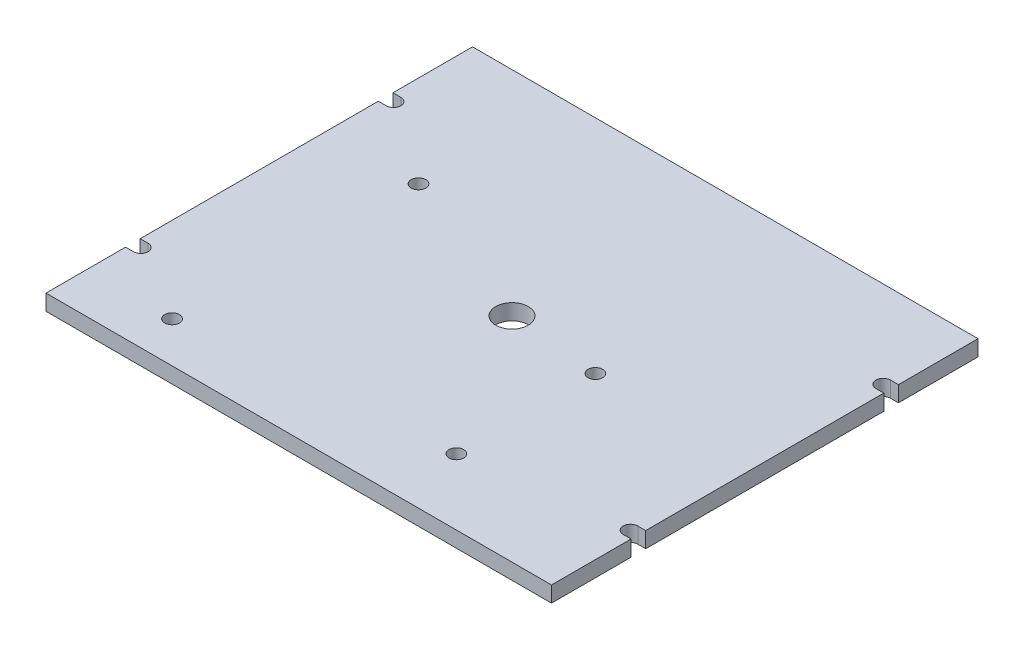
ISO-10303-21;
HEADER;
FILE_DESCRIPTION(('STEP AP214'),'2;1');
FILE_NAME('part.step','',(''),(''),'','','');
FILE_SCHEMA(('AUTOMOTIVE_DESIGN { 1 0 10303 214 1 1 1 1 }'));
ENDSEC;
DATA;
#1=APPLICATION_CONTEXT('core data for automotive mechanical design processes');
#2=APPLICATION_PROTOCOL_DEFINITION('international standard','automotive_design',2000,#1);
#3=PRODUCT_CONTEXT('',#1,'mechanical');
#4=PRODUCT('Part','Part','',(#3));
#5=PRODUCT_RELATED_PRODUCT_CATEGORY('part','',(#4));
#6=PRODUCT_DEFINITION_FORMATION('','',#4);
#7=PRODUCT_DEFINITION_CONTEXT('part definition',#1,'design');
#8=PRODUCT_DEFINITION('design','',#6,#7);
#9=PRODUCT_DEFINITION_SHAPE('','',#8);
#10=(LENGTH_UNIT() NAMED_UNIT(*) SI_UNIT(.MILLI.,.METRE.));
#11=(NAMED_UNIT(*) PLANE_ANGLE_UNIT() SI_UNIT($,.RADIAN.));
#12=(NAMED_UNIT(*) SI_UNIT($,.STERADIAN.) SOLID_ANGLE_UNIT());
#13=UNCERTAINTY_MEASURE_WITH_UNIT(LENGTH_MEASURE(1.E-05),#10,'distance_accuracy_value','');
#14=(GEOMETRIC_REPRESENTATION_CONTEXT(3) GLOBAL_UNCERTAINTY_ASSIGNED_CONTEXT((#13)) GLOBAL_UNIT_ASSIGNED_CONTEXT((#10,
#11,#12)) REPRESENTATION_CONTEXT('',''));
#15=CARTESIAN_POINT('',(0.,0.,0.));
#16=DIRECTION('',(0.,0.,1.));
#17=DIRECTION('',(1.,0.,0.));
#18=AXIS2_PLACEMENT_3D('',#15,#16,#17);
#19=CARTESIAN_POINT('',(50.8,3.175,42.8625));
#20=DIRECTION('',(-1.,0.,0.));
#21=DIRECTION('',(0.,0.,1.));
#22=AXIS2_PLACEMENT_3D('',#19,#20,#21);
#23=PLANE('',#22);
#24=DIRECTION('',(0.,0.,-1.));
#25=VECTOR('',#24,1.);
#26=CARTESIAN_POINT('',(50.8,0.,42.8625));
#27=LINE('',#26,#25);
#28=CARTESIAN_POINT('',(50.8,0.,42.8625));
#29=VERTEX_POINT('',#28);
#30=CARTESIAN_POINT('',(50.8,0.,26.8732));
#31=VERTEX_POINT('',#30);
#32=EDGE_CURVE('E322',#29,#31,#27,.T.);
#33=ORIENTED_EDGE('',*,*,#32,.T.);
#34=DIRECTION('',(0.,-1.,0.));
#35=VECTOR('',#34,1.);
#36=CARTESIAN_POINT('',(50.8,3.175,26.8732));
#37=LINE('',#36,#35);
#38=CARTESIAN_POINT('',(50.8,3.175,26.8732));
#39=VERTEX_POINT('',#38);
#40=EDGE_CURVE('E205',#39,#31,#37,.T.);
#41=ORIENTED_EDGE('',*,*,#40,.F.);
#42=DIRECTION('',(0.,0.,-1.));
#43=VECTOR('',#42,1.);
#44=CARTESIAN_POINT('',(50.8,3.175,42.8625));
#45=LINE('',#44,#43);
#46=CARTESIAN_POINT('',(50.8,3.175,42.8625));
#47=VERTEX_POINT('',#46);
#48=EDGE_CURVE('E308',#47,#39,#45,.T.);
#49=ORIENTED_EDGE('',*,*,#48,.F.);
#50=DIRECTION('',(0.,-1.,0.));
#51=VECTOR('',#50,1.);
#52=CARTESIAN_POINT('',(50.8,3.175,42.8625));
#53=LINE('',#52,#51);
#54=EDGE_CURVE('E321',#47,#29,#53,.T.);
#55=ORIENTED_EDGE('',*,*,#54,.T.);
#56=EDGE_LOOP('',(#33,#41,#49,#55));
#57=FACE_BOUND('',#56,.T.);
#58=ADVANCED_FACE('F34',(#57),#23,.F.);
#59=CARTESIAN_POINT('',(-50.8,3.175,42.8625));
#60=DIRECTION('',(1.,0.,0.));
#61=DIRECTION('',(0.,0.,-1.));
#62=AXIS2_PLACEMENT_3D('',#59,#60,#61);
#63=PLANE('',#62);
#64=DIRECTION('',(0.,0.,1.));
#65=VECTOR('',#64,1.);
#66=CARTESIAN_POINT('',(-50.8,0.,42.8625));
#67=LINE('',#66,#65);
#68=CARTESIAN_POINT('',(-50.8,0.,-23.9268));
#69=VERTEX_POINT('',#68);
#70=CARTESIAN_POINT('',(-50.8,0.,23.9268));
#71=VERTEX_POINT('',#70);
#72=EDGE_CURVE('E333',#69,#71,#67,.T.);
#73=ORIENTED_EDGE('',*,*,#72,.T.);
#74=DIRECTION('',(0.,-1.,0.));
#75=VECTOR('',#74,1.);
#76=CARTESIAN_POINT('',(-50.8,3.175,23.9268));
#77=LINE('',#76,#75);
#78=CARTESIAN_POINT('',(-50.8,3.175,23.9268));
#79=VERTEX_POINT('',#78);
#80=EDGE_CURVE('E226',#79,#71,#77,.T.);
#81=ORIENTED_EDGE('',*,*,#80,.F.);
#82=DIRECTION('',(0.,0.,1.));
#83=VECTOR('',#82,1.);
#84=CARTESIAN_POINT('',(-50.8,3.175,42.8625));
#85=LINE('',#84,#83);
#86=CARTESIAN_POINT('',(-50.8,3.175,-23.9268));
#87=VERTEX_POINT('',#86);
#88=EDGE_CURVE('E319',#87,#79,#85,.T.);
#89=ORIENTED_EDGE('',*,*,#88,.F.);
#90=DIRECTION('',(0.,-1.,0.));
#91=VECTOR('',#90,1.);
#92=CARTESIAN_POINT('',(-50.8,3.175,-23.9268));
#93=LINE('',#92,#91);
#94=EDGE_CURVE('E252',#87,#69,#93,.T.);
#95=ORIENTED_EDGE('',*,*,#94,.T.);
#96=EDGE_LOOP('',(#73,#81,#89,#95));
#97=FACE_BOUND('',#96,.T.);
#98=ADVANCED_FACE('F392',(#97),#63,.F.);
#99=CARTESIAN_POINT('',(-50.8,0.,-42.8625));
#100=VERTEX_POINT('',#99);
#101=CARTESIAN_POINT('',(-50.8,0.,-26.8732));
#102=VERTEX_POINT('',#101);
#103=EDGE_CURVE('E329',#100,#102,#67,.T.);
#104=ORIENTED_EDGE('',*,*,#103,.T.);
#105=DIRECTION('',(0.,-1.,0.));
#106=VECTOR('',#105,1.);
#107=CARTESIAN_POINT('',(-50.8,3.175,-26.8732));
#108=LINE('',#107,#106);
#109=CARTESIAN_POINT('',(-50.8,3.175,-26.8732));
#110=VERTEX_POINT('',#109);
#111=EDGE_CURVE('E250',#110,#102,#108,.T.);
#112=ORIENTED_EDGE('',*,*,#111,.F.);
#113=CARTESIAN_POINT('',(-50.8,3.175,-42.8625));
#114=VERTEX_POINT('',#113);
#115=EDGE_CURVE('E315',#114,#110,#85,.T.);
#116=ORIENTED_EDGE('',*,*,#115,.F.);
#117=DIRECTION('',(0.,-1.,0.));
#118=VECTOR('',#117,1.);
#119=CARTESIAN_POINT('',(-50.8,3.175,-42.8625));
#120=LINE('',#119,#118);
#121=EDGE_CURVE('E42',#114,#100,#120,.T.);
#122=ORIENTED_EDGE('',*,*,#121,.T.);
#123=EDGE_LOOP('',(#104,#112,#116,#122));
#124=FACE_BOUND('',#123,.T.);
#125=ADVANCED_FACE('F344',(#124),#63,.F.);
#126=CARTESIAN_POINT('',(50.8,3.175,23.9268));
#127=VERTEX_POINT('',#126);
#128=CARTESIAN_POINT('',(50.8,3.175,-23.9268));
#129=VERTEX_POINT('',#128);
#130=EDGE_CURVE('E311',#127,#129,#45,.T.);
#131=ORIENTED_EDGE('',*,*,#130,.F.);
#132=DIRECTION('',(0.,-1.,0.));
#133=VECTOR('',#132,1.);
#134=CARTESIAN_POINT('',(50.8,3.175,23.9268));
#135=LINE('',#134,#133);
#136=CARTESIAN_POINT('',(50.8,0.,23.9268));
#137=VERTEX_POINT('',#136);
#138=EDGE_CURVE('E177',#127,#137,#135,.T.);
#139=ORIENTED_EDGE('',*,*,#138,.T.);
#140=CARTESIAN_POINT('',(50.8,0.,-23.9268));
#141=VERTEX_POINT('',#140);
#142=EDGE_CURVE('E326',#137,#141,#27,.T.);
#143=ORIENTED_EDGE('',*,*,#142,.T.);
#144=DIRECTION('',(0.,-1.,0.));
#145=VECTOR('',#144,1.);
#146=CARTESIAN_POINT('',(50.8,3.175,-23.9268));
#147=LINE('',#146,#145);
#148=EDGE_CURVE('E276',#129,#141,#147,.T.);
#149=ORIENTED_EDGE('',*,*,#148,.F.);
#150=EDGE_LOOP('',(#131,#139,#143,#149));
#151=FACE_BOUND('',#150,.T.);
#152=ADVANCED_FACE('F368',(#151),#23,.F.);
#153=CARTESIAN_POINT('',(50.8,3.175,-26.8732));
#154=VERTEX_POINT('',#153);
#155=CARTESIAN_POINT('',(50.8,3.175,-42.8625));
#156=VERTEX_POINT('',#155);
#157=EDGE_CURVE('E312',#154,#156,#45,.T.);
#158=ORIENTED_EDGE('',*,*,#157,.F.);
#159=DIRECTION('',(0.,-1.,0.));
#160=VECTOR('',#159,1.);
#161=CARTESIAN_POINT('',(50.8,3.175,-26.8732));
#162=LINE('',#161,#160);
#163=CARTESIAN_POINT('',(50.8,0.,-26.8732));
#164=VERTEX_POINT('',#163);
#165=EDGE_CURVE('E279',#154,#164,#162,.T.);
#166=ORIENTED_EDGE('',*,*,#165,.T.);
#167=CARTESIAN_POINT('',(50.8,0.,-42.8625));
#168=VERTEX_POINT('',#167);
#169=EDGE_CURVE('E307',#164,#168,#27,.T.);
#170=ORIENTED_EDGE('',*,*,#169,.T.);
#171=DIRECTION('',(0.,-1.,0.));
#172=VECTOR('',#171,1.);
#173=CARTESIAN_POINT('',(50.8,3.175,-42.8625));
#174=LINE('',#173,#172);
#175=EDGE_CURVE('E11',#156,#168,#174,.T.);
#176=ORIENTED_EDGE('',*,*,#175,.F.);
#177=EDGE_LOOP('',(#158,#166,#170,#176));
#178=FACE_BOUND('',#177,.T.);
#179=ADVANCED_FACE('F36',(#178),#23,.F.);
#180=CARTESIAN_POINT('',(-50.8,3.175,-42.8625));
#181=DIRECTION('',(0.,0.,1.));
#182=DIRECTION('',(1.,0.,0.));
#183=AXIS2_PLACEMENT_3D('',#180,#181,#182);
#184=PLANE('',#183);
#185=DIRECTION('',(-1.,0.,0.));
#186=VECTOR('',#185,1.);
#187=CARTESIAN_POINT('',(-50.8,0.,-42.8625));
#188=LINE('',#187,#186);
#189=EDGE_CURVE('E325',#168,#100,#188,.T.);
#190=ORIENTED_EDGE('',*,*,#189,.T.);
#191=ORIENTED_EDGE('',*,*,#121,.F.);
#192=DIRECTION('',(-1.,0.,0.));
#193=VECTOR('',#192,1.);
#194=CARTESIAN_POINT('',(-50.8,3.175,-42.8625));
#195=LINE('',#194,#193);
#196=EDGE_CURVE('E310',#156,#114,#195,.T.);
#197=ORIENTED_EDGE('',*,*,#196,.F.);
#198=ORIENTED_EDGE('',*,*,#175,.T.);
#199=EDGE_LOOP('',(#190,#191,#197,#198));
#200=FACE_BOUND('',#199,.T.);
#201=ADVANCED_FACE('F362',(#200),#184,.F.);
#202=CARTESIAN_POINT('',(-50.8,3.175,26.8732));
#203=VERTEX_POINT('',#202);
#204=CARTESIAN_POINT('',(-50.8,3.175,42.8625));
#205=VERTEX_POINT('',#204);
#206=EDGE_CURVE('E314',#203,#205,#85,.T.);
#207=ORIENTED_EDGE('',*,*,#206,.F.);
#208=DIRECTION('',(0.,-1.,0.));
#209=VECTOR('',#208,1.);
#210=CARTESIAN_POINT('',(-50.8,3.175,26.8732));
#211=LINE('',#210,#209);
#212=CARTESIAN_POINT('',(-50.8,0.,26.8732));
#213=VERTEX_POINT('',#212);
#214=EDGE_CURVE('E228',#203,#213,#211,.T.);
#215=ORIENTED_EDGE('',*,*,#214,.T.);
#216=CARTESIAN_POINT('',(-50.8,0.,42.8625));
#217=VERTEX_POINT('',#216);
#218=EDGE_CURVE('E328',#213,#217,#67,.T.);
#219=ORIENTED_EDGE('',*,*,#218,.T.);
#220=DIRECTION('',(0.,-1.,0.));
#221=VECTOR('',#220,1.);
#222=CARTESIAN_POINT('',(-50.8,3.175,42.8625));
#223=LINE('',#222,#221);
#224=EDGE_CURVE('E337',#205,#217,#223,.T.);
#225=ORIENTED_EDGE('',*,*,#224,.F.);
#226=EDGE_LOOP('',(#207,#215,#219,#225));
#227=FACE_BOUND('',#226,.T.);
#228=ADVANCED_FACE('F399',(#227),#63,.F.);
#229=CARTESIAN_POINT('',(-50.8,3.175,42.8625));
#230=DIRECTION('',(0.,0.,-1.));
#231=DIRECTION('',(-1.,0.,0.));
#232=AXIS2_PLACEMENT_3D('',#229,#230,#231);
#233=PLANE('',#232);
#234=DIRECTION('',(1.,0.,0.));
#235=VECTOR('',#234,1.);
#236=CARTESIAN_POINT('',(-50.8,0.,42.8625));
#237=LINE('',#236,#235);
#238=EDGE_CURVE('E332',#217,#29,#237,.T.);
#239=ORIENTED_EDGE('',*,*,#238,.T.);
#240=ORIENTED_EDGE('',*,*,#54,.F.);
#241=DIRECTION('',(1.,0.,0.));
#242=VECTOR('',#241,1.);
#243=CARTESIAN_POINT('',(-50.8,3.175,42.8625));
#244=LINE('',#243,#242);
#245=EDGE_CURVE('E318',#205,#47,#244,.T.);
#246=ORIENTED_EDGE('',*,*,#245,.F.);
#247=ORIENTED_EDGE('',*,*,#224,.T.);
#248=EDGE_LOOP('',(#239,#240,#246,#247));
#249=FACE_BOUND('',#248,.T.);
#250=ADVANCED_FACE('F408',(#249),#233,.F.);
#251=CARTESIAN_POINT('',(0.,3.175,0.));
#252=DIRECTION('',(0.,-1.,0.));
#253=DIRECTION('',(0.,0.,-1.));
#254=AXIS2_PLACEMENT_3D('',#251,#252,#253);
#255=PLANE('',#254);
#256=CARTESIAN_POINT('',(0.,3.175,0.));
#257=DIRECTION('',(0.,-1.,0.));
#258=DIRECTION('',(0.,0.,-1.));
#259=AXIS2_PLACEMENT_3D('',#256,#257,#258);
#260=CIRCLE('',#259,3.2639);
#261=CARTESIAN_POINT('',(0.,3.175,-3.2639));
#262=VERTEX_POINT('',#261);
#263=EDGE_CURVE('E195',#262,#262,#260,.T.);
#264=ORIENTED_EDGE('',*,*,#263,.T.);
#265=EDGE_LOOP('',(#264));
#266=FACE_BOUND('',#265,.T.);
#267=CARTESIAN_POINT('',(18.415,3.175,1.65249999999999));
#268=DIRECTION('',(0.,-1.,0.));
#269=DIRECTION('',(0.,0.,-1.));
#270=AXIS2_PLACEMENT_3D('',#267,#268,#269);
#271=CIRCLE('',#270,1.4732);
#272=CARTESIAN_POINT('',(18.415,3.175,0.179299999999993));
#273=VERTEX_POINT('',#272);
#274=EDGE_CURVE('E286',#273,#273,#271,.T.);
#275=ORIENTED_EDGE('',*,*,#274,.T.);
#276=EDGE_LOOP('',(#275));
#277=FACE_BOUND('',#276,.T.);
#278=CARTESIAN_POINT('',(18.415,3.175,29.5925));
#279=DIRECTION('',(0.,-1.,0.));
#280=DIRECTION('',(0.,0.,-1.));
#281=AXIS2_PLACEMENT_3D('',#278,#279,#280);
#282=CIRCLE('',#281,1.4732);
#283=CARTESIAN_POINT('',(18.415,3.175,28.1193));
#284=VERTEX_POINT('',#283);
#285=EDGE_CURVE('E292',#284,#284,#282,.T.);
#286=ORIENTED_EDGE('',*,*,#285,.T.);
#287=EDGE_LOOP('',(#286));
#288=FACE_BOUND('',#287,.T.);
#289=CARTESIAN_POINT('',(-33.655,3.175,34.6725));
#290=DIRECTION('',(0.,-1.,0.));
#291=DIRECTION('',(0.,0.,-1.));
#292=AXIS2_PLACEMENT_3D('',#289,#290,#291);
#293=CIRCLE('',#292,1.4732);
#294=CARTESIAN_POINT('',(-33.655,3.175,33.1993));
#295=VERTEX_POINT('',#294);
#296=EDGE_CURVE('E298',#295,#295,#293,.T.);
#297=ORIENTED_EDGE('',*,*,#296,.T.);
#298=EDGE_LOOP('',(#297));
#299=FACE_BOUND('',#298,.T.);
#300=CARTESIAN_POINT('',(-32.385,3.175,-13.5875));
#301=DIRECTION('',(0.,-1.,0.));
#302=DIRECTION('',(0.,0.,-1.));
#303=AXIS2_PLACEMENT_3D('',#300,#301,#302);
#304=CIRCLE('',#303,1.4732);
#305=CARTESIAN_POINT('',(-32.385,3.175,-15.0607));
#306=VERTEX_POINT('',#305);
#307=EDGE_CURVE('E304',#306,#306,#304,.T.);
#308=ORIENTED_EDGE('',*,*,#307,.T.);
#309=EDGE_LOOP('',(#308));
#310=FACE_BOUND('',#309,.T.);
#311=ORIENTED_EDGE('',*,*,#48,.T.);
#312=DIRECTION('',(-1.,0.,0.));
#313=VECTOR('',#312,1.);
#314=CARTESIAN_POINT('',(49.2125,3.175,26.8732));
#315=LINE('',#314,#313);
#316=CARTESIAN_POINT('',(49.2125,3.175,26.8732));
#317=VERTEX_POINT('',#316);
#318=EDGE_CURVE('E178',#39,#317,#315,.T.);
#319=ORIENTED_EDGE('',*,*,#318,.T.);
#320=CARTESIAN_POINT('',(49.2125,3.175,25.4));
#321=DIRECTION('',(0.,-1.,0.));
#322=DIRECTION('',(0.,0.,-1.));
#323=AXIS2_PLACEMENT_3D('',#320,#321,#322);
#324=CIRCLE('',#323,1.4732);
#325=CARTESIAN_POINT('',(49.2125,3.175,23.9268));
#326=VERTEX_POINT('',#325);
#327=EDGE_CURVE('E173',#317,#326,#324,.T.);
#328=ORIENTED_EDGE('',*,*,#327,.T.);
#329=DIRECTION('',(1.,0.,0.));
#330=VECTOR('',#329,1.);
#331=CARTESIAN_POINT('',(49.2125,3.175,23.9268));
#332=LINE('',#331,#330);
#333=EDGE_CURVE('E181',#326,#127,#332,.T.);
#334=ORIENTED_EDGE('',*,*,#333,.T.);
#335=ORIENTED_EDGE('',*,*,#130,.T.);
#336=DIRECTION('',(-1.,0.,0.));
#337=VECTOR('',#336,1.);
#338=CARTESIAN_POINT('',(49.2125,3.175,-23.9268));
#339=LINE('',#338,#337);
#340=CARTESIAN_POINT('',(49.2125,3.175,-23.9268));
#341=VERTEX_POINT('',#340);
#342=EDGE_CURVE('E264',#129,#341,#339,.T.);
#343=ORIENTED_EDGE('',*,*,#342,.T.);
#344=CARTESIAN_POINT('',(49.2125,3.175,-25.4));
#345=DIRECTION('',(0.,-1.,0.));
#346=DIRECTION('',(0.,0.,-1.));
#347=AXIS2_PLACEMENT_3D('',#344,#345,#346);
#348=CIRCLE('',#347,1.4732);
#349=CARTESIAN_POINT('',(49.2125,3.175,-26.8732));
#350=VERTEX_POINT('',#349);
#351=EDGE_CURVE('E257',#341,#350,#348,.T.);
#352=ORIENTED_EDGE('',*,*,#351,.T.);
#353=DIRECTION('',(1.,0.,0.));
#354=VECTOR('',#353,1.);
#355=CARTESIAN_POINT('',(49.2125,3.175,-26.8732));
#356=LINE('',#355,#354);
#357=EDGE_CURVE('E260',#350,#154,#356,.T.);
#358=ORIENTED_EDGE('',*,*,#357,.T.);
#359=ORIENTED_EDGE('',*,*,#157,.T.);
#360=ORIENTED_EDGE('',*,*,#196,.T.);
#361=ORIENTED_EDGE('',*,*,#115,.T.);
#362=DIRECTION('',(1.,0.,0.));
#363=VECTOR('',#362,1.);
#364=CARTESIAN_POINT('',(-49.2125,3.175,-26.8732));
#365=LINE('',#364,#363);
#366=CARTESIAN_POINT('',(-49.2125,3.175,-26.8732));
#367=VERTEX_POINT('',#366);
#368=EDGE_CURVE('E239',#110,#367,#365,.T.);
#369=ORIENTED_EDGE('',*,*,#368,.T.);
#370=CARTESIAN_POINT('',(-49.2125,3.175,-25.4));
#371=DIRECTION('',(0.,-1.,0.));
#372=DIRECTION('',(0.,0.,1.));
#373=AXIS2_PLACEMENT_3D('',#370,#371,#372);
#374=CIRCLE('',#373,1.4732);
#375=CARTESIAN_POINT('',(-49.2125,3.175,-23.9268));
#376=VERTEX_POINT('',#375);
#377=EDGE_CURVE('E232',#367,#376,#374,.T.);
#378=ORIENTED_EDGE('',*,*,#377,.T.);
#379=DIRECTION('',(-1.,0.,0.));
#380=VECTOR('',#379,1.);
#381=CARTESIAN_POINT('',(-49.2125,3.175,-23.9268));
#382=LINE('',#381,#380);
#383=EDGE_CURVE('E235',#376,#87,#382,.T.);
#384=ORIENTED_EDGE('',*,*,#383,.T.);
#385=ORIENTED_EDGE('',*,*,#88,.T.);
#386=DIRECTION('',(1.,0.,0.));
#387=VECTOR('',#386,1.);
#388=CARTESIAN_POINT('',(-49.2125,3.175,23.9268));
#389=LINE('',#388,#387);
#390=CARTESIAN_POINT('',(-49.2125,3.175,23.9268));
#391=VERTEX_POINT('',#390);
#392=EDGE_CURVE('E215',#79,#391,#389,.T.);
#393=ORIENTED_EDGE('',*,*,#392,.T.);
#394=CARTESIAN_POINT('',(-49.2125,3.175,25.4));
#395=DIRECTION('',(0.,-1.,0.));
#396=DIRECTION('',(0.,0.,1.));
#397=AXIS2_PLACEMENT_3D('',#394,#395,#396);
#398=CIRCLE('',#397,1.4732);
#399=CARTESIAN_POINT('',(-49.2125,3.175,26.8732));
#400=VERTEX_POINT('',#399);
#401=EDGE_CURVE('E208',#391,#400,#398,.T.);
#402=ORIENTED_EDGE('',*,*,#401,.T.);
#403=DIRECTION('',(-1.,0.,0.));
#404=VECTOR('',#403,1.);
#405=CARTESIAN_POINT('',(-49.2125,3.175,26.8732));
#406=LINE('',#405,#404);
#407=EDGE_CURVE('E211',#400,#203,#406,.T.);
#408=ORIENTED_EDGE('',*,*,#407,.T.);
#409=ORIENTED_EDGE('',*,*,#206,.T.);
#410=ORIENTED_EDGE('',*,*,#245,.T.);
#411=EDGE_LOOP('',(#311,#319,#328,#334,#335,#343,#352,#358,#359,#360,#361,#369,#378,#384,#385,
#393,#402,#408,#409,#410));
#412=FACE_BOUND('',#411,.T.);
#413=ADVANCED_FACE('F188',(#266,#277,#288,#299,#310,#412),#255,.F.);
#414=CARTESIAN_POINT('',(0.,0.,0.));
#415=DIRECTION('',(0.,-1.,0.));
#416=DIRECTION('',(0.,0.,-1.));
#417=AXIS2_PLACEMENT_3D('',#414,#415,#416);
#418=PLANE('',#417);
#419=CARTESIAN_POINT('',(0.,0.,0.));
#420=DIRECTION('',(0.,-1.,0.));
#421=DIRECTION('',(0.,0.,-1.));
#422=AXIS2_PLACEMENT_3D('',#419,#420,#421);
#423=CIRCLE('',#422,3.2639);
#424=CARTESIAN_POINT('',(0.,0.,-3.2639));
#425=VERTEX_POINT('',#424);
#426=EDGE_CURVE('E679',#425,#425,#423,.T.);
#427=ORIENTED_EDGE('',*,*,#426,.F.);
#428=EDGE_LOOP('',(#427));
#429=FACE_BOUND('',#428,.T.);
#430=DIRECTION('',(-1.,0.,0.));
#431=VECTOR('',#430,1.);
#432=CARTESIAN_POINT('',(49.2125,0.,26.8732));
#433=LINE('',#432,#431);
#434=CARTESIAN_POINT('',(49.2125,0.,26.8732));
#435=VERTEX_POINT('',#434);
#436=EDGE_CURVE('E189',#31,#435,#433,.T.);
#437=ORIENTED_EDGE('',*,*,#436,.F.);
#438=ORIENTED_EDGE('',*,*,#32,.F.);
#439=ORIENTED_EDGE('',*,*,#238,.F.);
#440=ORIENTED_EDGE('',*,*,#218,.F.);
#441=DIRECTION('',(-1.,0.,0.));
#442=VECTOR('',#441,1.);
#443=CARTESIAN_POINT('',(-49.2125,0.,26.8732));
#444=LINE('',#443,#442);
#445=CARTESIAN_POINT('',(-49.2125,0.,26.8732));
#446=VERTEX_POINT('',#445);
#447=EDGE_CURVE('E220',#446,#213,#444,.T.);
#448=ORIENTED_EDGE('',*,*,#447,.F.);
#449=CARTESIAN_POINT('',(-49.2125,0.,25.4));
#450=DIRECTION('',(0.,-1.,0.));
#451=DIRECTION('',(0.,0.,1.));
#452=AXIS2_PLACEMENT_3D('',#449,#450,#451);
#453=CIRCLE('',#452,1.4732);
#454=CARTESIAN_POINT('',(-49.2125,0.,23.9268));
#455=VERTEX_POINT('',#454);
#456=EDGE_CURVE('E57',#455,#446,#453,.T.);
#457=ORIENTED_EDGE('',*,*,#456,.F.);
#458=DIRECTION('',(1.,0.,0.));
#459=VECTOR('',#458,1.);
#460=CARTESIAN_POINT('',(-49.2125,0.,23.9268));
#461=LINE('',#460,#459);
#462=EDGE_CURVE('E212',#71,#455,#461,.T.);
#463=ORIENTED_EDGE('',*,*,#462,.F.);
#464=ORIENTED_EDGE('',*,*,#72,.F.);
#465=DIRECTION('',(-1.,0.,0.));
#466=VECTOR('',#465,1.);
#467=CARTESIAN_POINT('',(-49.2125,0.,-23.9268));
#468=LINE('',#467,#466);
#469=CARTESIAN_POINT('',(-49.2125,0.,-23.9268));
#470=VERTEX_POINT('',#469);
#471=EDGE_CURVE('E245',#470,#69,#468,.T.);
#472=ORIENTED_EDGE('',*,*,#471,.F.);
#473=CARTESIAN_POINT('',(-49.2125,0.,-25.4));
#474=DIRECTION('',(0.,-1.,0.));
#475=DIRECTION('',(0.,0.,1.));
#476=AXIS2_PLACEMENT_3D('',#473,#474,#475);
#477=CIRCLE('',#476,1.4732);
#478=CARTESIAN_POINT('',(-49.2125,0.,-26.8732));
#479=VERTEX_POINT('',#478);
#480=EDGE_CURVE('E243',#479,#470,#477,.T.);
#481=ORIENTED_EDGE('',*,*,#480,.F.);
#482=DIRECTION('',(1.,0.,0.));
#483=VECTOR('',#482,1.);
#484=CARTESIAN_POINT('',(-49.2125,0.,-26.8732));
#485=LINE('',#484,#483);
#486=EDGE_CURVE('E236',#102,#479,#485,.T.);
#487=ORIENTED_EDGE('',*,*,#486,.F.);
#488=ORIENTED_EDGE('',*,*,#103,.F.);
#489=ORIENTED_EDGE('',*,*,#189,.F.);
#490=ORIENTED_EDGE('',*,*,#169,.F.);
#491=DIRECTION('',(1.,0.,0.));
#492=VECTOR('',#491,1.);
#493=CARTESIAN_POINT('',(49.2125,0.,-26.8732));
#494=LINE('',#493,#492);
#495=CARTESIAN_POINT('',(49.2125,0.,-26.8732));
#496=VERTEX_POINT('',#495);
#497=EDGE_CURVE('E269',#496,#164,#494,.T.);
#498=ORIENTED_EDGE('',*,*,#497,.F.);
#499=CARTESIAN_POINT('',(49.2125,0.,-25.4));
#500=DIRECTION('',(0.,-1.,0.));
#501=DIRECTION('',(0.,0.,-1.));
#502=AXIS2_PLACEMENT_3D('',#499,#500,#501);
#503=CIRCLE('',#502,1.4732);
#504=CARTESIAN_POINT('',(49.2125,0.,-23.9268));
#505=VERTEX_POINT('',#504);
#506=EDGE_CURVE('E204',#505,#496,#503,.T.);
#507=ORIENTED_EDGE('',*,*,#506,.F.);
#508=DIRECTION('',(-1.,0.,0.));
#509=VECTOR('',#508,1.);
#510=CARTESIAN_POINT('',(49.2125,0.,-23.9268));
#511=LINE('',#510,#509);
#512=EDGE_CURVE('E261',#141,#505,#511,.T.);
#513=ORIENTED_EDGE('',*,*,#512,.F.);
#514=ORIENTED_EDGE('',*,*,#142,.F.);
#515=DIRECTION('',(1.,0.,0.));
#516=VECTOR('',#515,1.);
#517=CARTESIAN_POINT('',(49.2125,0.,23.9268));
#518=LINE('',#517,#516);
#519=CARTESIAN_POINT('',(49.2125,0.,23.9268));
#520=VERTEX_POINT('',#519);
#521=EDGE_CURVE('E192',#520,#137,#518,.T.);
#522=ORIENTED_EDGE('',*,*,#521,.F.);
#523=CARTESIAN_POINT('',(49.2125,0.,25.4));
#524=DIRECTION('',(0.,-1.,0.));
#525=DIRECTION('',(0.,0.,-1.));
#526=AXIS2_PLACEMENT_3D('',#523,#524,#525);
#527=CIRCLE('',#526,1.4732);
#528=EDGE_CURVE('E49',#435,#520,#527,.T.);
#529=ORIENTED_EDGE('',*,*,#528,.F.);
#530=EDGE_LOOP('',(#437,#438,#439,#440,#448,#457,#463,#464,#472,#481,#487,#488,#489,#490,#498,
#507,#513,#514,#522,#529));
#531=FACE_BOUND('',#530,.T.);
#532=CARTESIAN_POINT('',(18.415,0.,1.65249999999999));
#533=DIRECTION('',(0.,-1.,0.));
#534=DIRECTION('',(0.,0.,-1.));
#535=AXIS2_PLACEMENT_3D('',#532,#533,#534);
#536=CIRCLE('',#535,1.4732);
#537=CARTESIAN_POINT('',(18.415,0.,0.179299999999993));
#538=VERTEX_POINT('',#537);
#539=EDGE_CURVE('E275',#538,#538,#536,.T.);
#540=ORIENTED_EDGE('',*,*,#539,.F.);
#541=EDGE_LOOP('',(#540));
#542=FACE_BOUND('',#541,.T.);
#543=CARTESIAN_POINT('',(18.415,0.,29.5925));
#544=DIRECTION('',(0.,-1.,0.));
#545=DIRECTION('',(0.,0.,-1.));
#546=AXIS2_PLACEMENT_3D('',#543,#544,#545);
#547=CIRCLE('',#546,1.4732);
#548=CARTESIAN_POINT('',(18.415,0.,28.1193));
#549=VERTEX_POINT('',#548);
#550=EDGE_CURVE('E289',#549,#549,#547,.T.);
#551=ORIENTED_EDGE('',*,*,#550,.F.);
#552=EDGE_LOOP('',(#551));
#553=FACE_BOUND('',#552,.T.);
#554=CARTESIAN_POINT('',(-33.655,0.,34.6725));
#555=DIRECTION('',(0.,-1.,0.));
#556=DIRECTION('',(0.,0.,-1.));
#557=AXIS2_PLACEMENT_3D('',#554,#555,#556);
#558=CIRCLE('',#557,1.4732);
#559=CARTESIAN_POINT('',(-33.655,0.,33.1993));
#560=VERTEX_POINT('',#559);
#561=EDGE_CURVE('E295',#560,#560,#558,.T.);
#562=ORIENTED_EDGE('',*,*,#561,.F.);
#563=EDGE_LOOP('',(#562));
#564=FACE_BOUND('',#563,.T.);
#565=CARTESIAN_POINT('',(-32.385,0.,-13.5875));
#566=DIRECTION('',(0.,-1.,0.));
#567=DIRECTION('',(0.,0.,-1.));
#568=AXIS2_PLACEMENT_3D('',#565,#566,#567);
#569=CIRCLE('',#568,1.4732);
#570=CARTESIAN_POINT('',(-32.385,0.,-15.0607));
#571=VERTEX_POINT('',#570);
#572=EDGE_CURVE('E301',#571,#571,#569,.T.);
#573=ORIENTED_EDGE('',*,*,#572,.F.);
#574=EDGE_LOOP('',(#573));
#575=FACE_BOUND('',#574,.T.);
#576=ADVANCED_FACE('F352',(#429,#531,#542,#553,#564,#575),#418,.T.);
#577=CARTESIAN_POINT('',(-32.385,0.,-13.5875));
#578=DIRECTION('',(0.,-1.,0.));
#579=DIRECTION('',(0.,0.,-1.));
#580=AXIS2_PLACEMENT_3D('',#577,#578,#579);
#581=CYLINDRICAL_SURFACE('',#580,1.4732);
#582=ORIENTED_EDGE('',*,*,#307,.F.);
#583=EDGE_LOOP('',(#582));
#584=FACE_BOUND('',#583,.T.);
#585=ORIENTED_EDGE('',*,*,#572,.T.);
#586=EDGE_LOOP('',(#585));
#587=FACE_BOUND('',#586,.T.);
#588=ADVANCED_FACE('F416',(#584,#587),#581,.F.);
#589=CARTESIAN_POINT('',(-33.655,0.,34.6725));
#590=DIRECTION('',(0.,-1.,0.));
#591=DIRECTION('',(0.,0.,-1.));
#592=AXIS2_PLACEMENT_3D('',#589,#590,#591);
#593=CYLINDRICAL_SURFACE('',#592,1.4732);
#594=ORIENTED_EDGE('',*,*,#296,.F.);
#595=EDGE_LOOP('',(#594));
#596=FACE_BOUND('',#595,.T.);
#597=ORIENTED_EDGE('',*,*,#561,.T.);
#598=EDGE_LOOP('',(#597));
#599=FACE_BOUND('',#598,.T.);
#600=ADVANCED_FACE('F423',(#596,#599),#593,.F.);
#601=CARTESIAN_POINT('',(18.415,0.,29.5925));
#602=DIRECTION('',(0.,-1.,0.));
#603=DIRECTION('',(0.,0.,-1.));
#604=AXIS2_PLACEMENT_3D('',#601,#602,#603);
#605=CYLINDRICAL_SURFACE('',#604,1.4732);
#606=ORIENTED_EDGE('',*,*,#285,.F.);
#607=EDGE_LOOP('',(#606));
#608=FACE_BOUND('',#607,.T.);
#609=ORIENTED_EDGE('',*,*,#550,.T.);
#610=EDGE_LOOP('',(#609));
#611=FACE_BOUND('',#610,.T.);
#612=ADVANCED_FACE('F427',(#608,#611),#605,.F.);
#613=CARTESIAN_POINT('',(18.415,0.,1.65249999999999));
#614=DIRECTION('',(0.,-1.,0.));
#615=DIRECTION('',(0.,0.,-1.));
#616=AXIS2_PLACEMENT_3D('',#613,#614,#615);
#617=CYLINDRICAL_SURFACE('',#616,1.4732);
#618=ORIENTED_EDGE('',*,*,#274,.F.);
#619=EDGE_LOOP('',(#618));
#620=FACE_BOUND('',#619,.T.);
#621=ORIENTED_EDGE('',*,*,#539,.T.);
#622=EDGE_LOOP('',(#621));
#623=FACE_BOUND('',#622,.T.);
#624=ADVANCED_FACE('F431',(#620,#623),#617,.F.);
#625=CARTESIAN_POINT('',(49.2125,3.175,-25.4));
#626=DIRECTION('',(0.,-1.,0.));
#627=DIRECTION('',(0.,0.,-1.));
#628=AXIS2_PLACEMENT_3D('',#625,#626,#627);
#629=CYLINDRICAL_SURFACE('',#628,1.4732);
#630=ORIENTED_EDGE('',*,*,#506,.T.);
#631=DIRECTION('',(0.,-1.,0.));
#632=VECTOR('',#631,1.);
#633=CARTESIAN_POINT('',(49.2125,3.175,-26.8732));
#634=LINE('',#633,#632);
#635=EDGE_CURVE('E267',#350,#496,#634,.T.);
#636=ORIENTED_EDGE('',*,*,#635,.F.);
#637=ORIENTED_EDGE('',*,*,#351,.F.);
#638=DIRECTION('',(0.,-1.,0.));
#639=VECTOR('',#638,1.);
#640=CARTESIAN_POINT('',(49.2125,3.175,-23.9268));
#641=LINE('',#640,#639);
#642=EDGE_CURVE('E273',#341,#505,#641,.T.);
#643=ORIENTED_EDGE('',*,*,#642,.T.);
#644=EDGE_LOOP('',(#630,#636,#637,#643));
#645=FACE_BOUND('',#644,.T.);
#646=ADVANCED_FACE('F375',(#645),#629,.F.);
#647=CARTESIAN_POINT('',(49.2125,3.175,-23.9268));
#648=DIRECTION('',(0.,0.,1.));
#649=DIRECTION('',(1.,0.,0.));
#650=AXIS2_PLACEMENT_3D('',#647,#648,#649);
#651=PLANE('',#650);
#652=ORIENTED_EDGE('',*,*,#512,.T.);
#653=ORIENTED_EDGE('',*,*,#642,.F.);
#654=ORIENTED_EDGE('',*,*,#342,.F.);
#655=ORIENTED_EDGE('',*,*,#148,.T.);
#656=EDGE_LOOP('',(#652,#653,#654,#655));
#657=FACE_BOUND('',#656,.T.);
#658=ADVANCED_FACE('F372',(#657),#651,.F.);
#659=CARTESIAN_POINT('',(49.2125,3.175,-26.8732));
#660=DIRECTION('',(0.,0.,-1.));
#661=DIRECTION('',(-1.,0.,0.));
#662=AXIS2_PLACEMENT_3D('',#659,#660,#661);
#663=PLANE('',#662);
#664=ORIENTED_EDGE('',*,*,#497,.T.);
#665=ORIENTED_EDGE('',*,*,#165,.F.);
#666=ORIENTED_EDGE('',*,*,#357,.F.);
#667=ORIENTED_EDGE('',*,*,#635,.T.);
#668=EDGE_LOOP('',(#664,#665,#666,#667));
#669=FACE_BOUND('',#668,.T.);
#670=ADVANCED_FACE('F379',(#669),#663,.F.);
#671=CARTESIAN_POINT('',(-49.2125,3.175,-25.4));
#672=DIRECTION('',(0.,-1.,0.));
#673=DIRECTION('',(0.,0.,-1.));
#674=AXIS2_PLACEMENT_3D('',#671,#672,#673);
#675=CYLINDRICAL_SURFACE('',#674,1.4732);
#676=ORIENTED_EDGE('',*,*,#480,.T.);
#677=DIRECTION('',(0.,-1.,0.));
#678=VECTOR('',#677,1.);
#679=CARTESIAN_POINT('',(-49.2125,3.175,-23.9268));
#680=LINE('',#679,#678);
#681=EDGE_CURVE('E242',#376,#470,#680,.T.);
#682=ORIENTED_EDGE('',*,*,#681,.F.);
#683=ORIENTED_EDGE('',*,*,#377,.F.);
#684=DIRECTION('',(0.,-1.,0.));
#685=VECTOR('',#684,1.);
#686=CARTESIAN_POINT('',(-49.2125,3.175,-26.8732));
#687=LINE('',#686,#685);
#688=EDGE_CURVE('E221',#367,#479,#687,.T.);
#689=ORIENTED_EDGE('',*,*,#688,.T.);
#690=EDGE_LOOP('',(#676,#682,#683,#689));
#691=FACE_BOUND('',#690,.T.);
#692=ADVANCED_FACE('F381',(#691),#675,.F.);
#693=CARTESIAN_POINT('',(-49.2125,3.175,-26.8732));
#694=DIRECTION('',(0.,0.,-1.));
#695=DIRECTION('',(-1.,0.,0.));
#696=AXIS2_PLACEMENT_3D('',#693,#694,#695);
#697=PLANE('',#696);
#698=ORIENTED_EDGE('',*,*,#486,.T.);
#699=ORIENTED_EDGE('',*,*,#688,.F.);
#700=ORIENTED_EDGE('',*,*,#368,.F.);
#701=ORIENTED_EDGE('',*,*,#111,.T.);
#702=EDGE_LOOP('',(#698,#699,#700,#701));
#703=FACE_BOUND('',#702,.T.);
#704=ADVANCED_FACE('F358',(#703),#697,.F.);
#705=CARTESIAN_POINT('',(-49.2125,3.175,-23.9268));
#706=DIRECTION('',(0.,0.,1.));
#707=DIRECTION('',(1.,0.,0.));
#708=AXIS2_PLACEMENT_3D('',#705,#706,#707);
#709=PLANE('',#708);
#710=ORIENTED_EDGE('',*,*,#471,.T.);
#711=ORIENTED_EDGE('',*,*,#94,.F.);
#712=ORIENTED_EDGE('',*,*,#383,.F.);
#713=ORIENTED_EDGE('',*,*,#681,.T.);
#714=EDGE_LOOP('',(#710,#711,#712,#713));
#715=FACE_BOUND('',#714,.T.);
#716=ADVANCED_FACE('F463',(#715),#709,.F.);
#717=CARTESIAN_POINT('',(-49.2125,3.175,25.4));
#718=DIRECTION('',(0.,-1.,0.));
#719=DIRECTION('',(0.,0.,-1.));
#720=AXIS2_PLACEMENT_3D('',#717,#718,#719);
#721=CYLINDRICAL_SURFACE('',#720,1.4732);
#722=ORIENTED_EDGE('',*,*,#456,.T.);
#723=DIRECTION('',(0.,-1.,0.));
#724=VECTOR('',#723,1.);
#725=CARTESIAN_POINT('',(-49.2125,3.175,26.8732));
#726=LINE('',#725,#724);
#727=EDGE_CURVE('E218',#400,#446,#726,.T.);
#728=ORIENTED_EDGE('',*,*,#727,.F.);
#729=ORIENTED_EDGE('',*,*,#401,.F.);
#730=DIRECTION('',(0.,-1.,0.));
#731=VECTOR('',#730,1.);
#732=CARTESIAN_POINT('',(-49.2125,3.175,23.9268));
#733=LINE('',#732,#731);
#734=EDGE_CURVE('E200',#391,#455,#733,.T.);
#735=ORIENTED_EDGE('',*,*,#734,.T.);
#736=EDGE_LOOP('',(#722,#728,#729,#735));
#737=FACE_BOUND('',#736,.T.);
#738=ADVANCED_FACE('F472',(#737),#721,.F.);
#739=CARTESIAN_POINT('',(-49.2125,3.175,23.9268));
#740=DIRECTION('',(0.,0.,-1.));
#741=DIRECTION('',(-1.,0.,0.));
#742=AXIS2_PLACEMENT_3D('',#739,#740,#741);
#743=PLANE('',#742);
#744=ORIENTED_EDGE('',*,*,#462,.T.);
#745=ORIENTED_EDGE('',*,*,#734,.F.);
#746=ORIENTED_EDGE('',*,*,#392,.F.);
#747=ORIENTED_EDGE('',*,*,#80,.T.);
#748=EDGE_LOOP('',(#744,#745,#746,#747));
#749=FACE_BOUND('',#748,.T.);
#750=ADVANCED_FACE('F482',(#749),#743,.F.);
#751=CARTESIAN_POINT('',(-49.2125,3.175,26.8732));
#752=DIRECTION('',(0.,0.,1.));
#753=DIRECTION('',(1.,0.,0.));
#754=AXIS2_PLACEMENT_3D('',#751,#752,#753);
#755=PLANE('',#754);
#756=ORIENTED_EDGE('',*,*,#447,.T.);
#757=ORIENTED_EDGE('',*,*,#214,.F.);
#758=ORIENTED_EDGE('',*,*,#407,.F.);
#759=ORIENTED_EDGE('',*,*,#727,.T.);
#760=EDGE_LOOP('',(#756,#757,#758,#759));
#761=FACE_BOUND('',#760,.T.);
#762=ADVANCED_FACE('F491',(#761),#755,.F.);
#763=CARTESIAN_POINT('',(49.2125,3.175,25.4));
#764=DIRECTION('',(0.,-1.,0.));
#765=DIRECTION('',(0.,0.,-1.));
#766=AXIS2_PLACEMENT_3D('',#763,#764,#765);
#767=CYLINDRICAL_SURFACE('',#766,1.4732);
#768=ORIENTED_EDGE('',*,*,#528,.T.);
#769=DIRECTION('',(0.,-1.,0.));
#770=VECTOR('',#769,1.);
#771=CARTESIAN_POINT('',(49.2125,3.175,23.9268));
#772=LINE('',#771,#770);
#773=EDGE_CURVE('E169',#326,#520,#772,.T.);
#774=ORIENTED_EDGE('',*,*,#773,.F.);
#775=ORIENTED_EDGE('',*,*,#327,.F.);
#776=DIRECTION('',(0.,-1.,0.));
#777=VECTOR('',#776,1.);
#778=CARTESIAN_POINT('',(49.2125,3.175,26.8732));
#779=LINE('',#778,#777);
#780=EDGE_CURVE('E202',#317,#435,#779,.T.);
#781=ORIENTED_EDGE('',*,*,#780,.T.);
#782=EDGE_LOOP('',(#768,#774,#775,#781));
#783=FACE_BOUND('',#782,.T.);
#784=ADVANCED_FACE('F171',(#783),#767,.F.);
#785=CARTESIAN_POINT('',(49.2125,3.175,26.8732));
#786=DIRECTION('',(0.,0.,1.));
#787=DIRECTION('',(1.,0.,0.));
#788=AXIS2_PLACEMENT_3D('',#785,#786,#787);
#789=PLANE('',#788);
#790=ORIENTED_EDGE('',*,*,#436,.T.);
#791=ORIENTED_EDGE('',*,*,#780,.F.);
#792=ORIENTED_EDGE('',*,*,#318,.F.);
#793=ORIENTED_EDGE('',*,*,#40,.T.);
#794=EDGE_LOOP('',(#790,#791,#792,#793));
#795=FACE_BOUND('',#794,.T.);
#796=ADVANCED_FACE('F510',(#795),#789,.F.);
#797=CARTESIAN_POINT('',(49.2125,3.175,23.9268));
#798=DIRECTION('',(0.,0.,-1.));
#799=DIRECTION('',(-1.,0.,0.));
#800=AXIS2_PLACEMENT_3D('',#797,#798,#799);
#801=PLANE('',#800);
#802=ORIENTED_EDGE('',*,*,#521,.T.);
#803=ORIENTED_EDGE('',*,*,#138,.F.);
#804=ORIENTED_EDGE('',*,*,#333,.F.);
#805=ORIENTED_EDGE('',*,*,#773,.T.);
#806=EDGE_LOOP('',(#802,#803,#804,#805));
#807=FACE_BOUND('',#806,.T.);
#808=ADVANCED_FACE('F182',(#807),#801,.F.);
#809=CARTESIAN_POINT('',(0.,0.,0.));
#810=DIRECTION('',(0.,-1.,0.));
#811=DIRECTION('',(0.,0.,-1.));
#812=AXIS2_PLACEMENT_3D('',#809,#810,#811);
#813=CYLINDRICAL_SURFACE('',#812,3.2639);
#814=ORIENTED_EDGE('',*,*,#263,.F.);
#815=EDGE_LOOP('',(#814));
#816=FACE_BOUND('',#815,.T.);
#817=ORIENTED_EDGE('',*,*,#426,.T.);
#818=EDGE_LOOP('',(#817));
#819=FACE_BOUND('',#818,.T.);
#820=ADVANCED_FACE('F528',(#816,#819),#813,.F.);
#821=CLOSED_SHELL('',(#58,#98,#125,#152,#179,#201,#228,#250,#413,#576,#588,#600,#612,#624,#646,
#658,#670,#692,#704,#716,#738,#750,#762,#784,#796,#808,#820));
#822=MANIFOLD_SOLID_BREP('B2',#821);
#823=ADVANCED_BREP_SHAPE_REPRESENTATION('',(#18,#822),#14);
#824=SHAPE_DEFINITION_REPRESENTATION(#9,#823);
ENDSEC;
END-ISO-10303-21;
